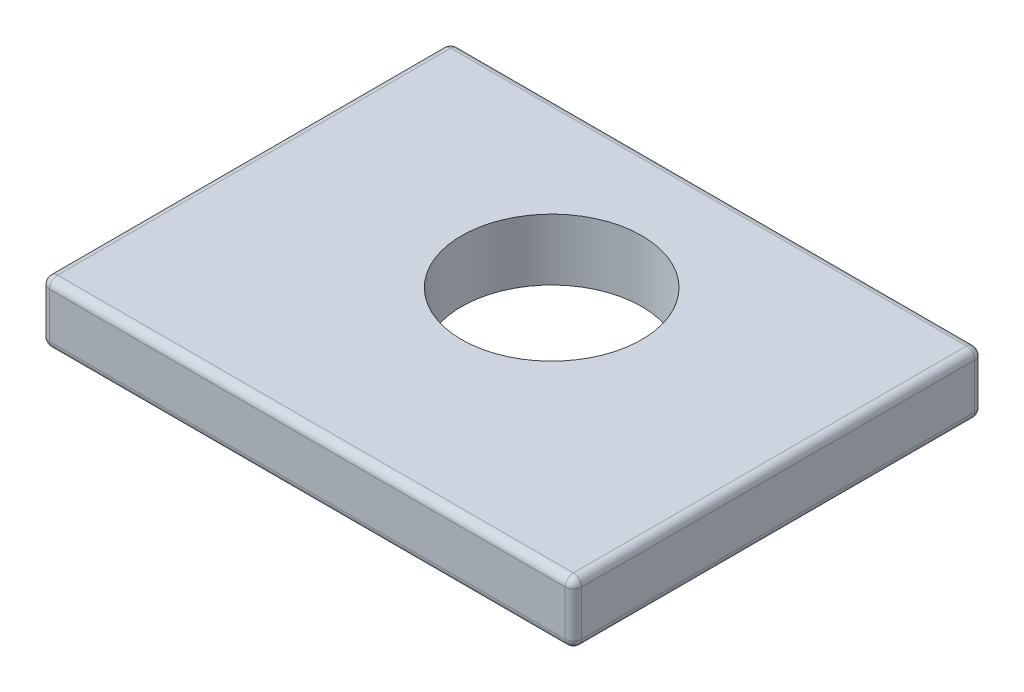
ISO-10303-21;
HEADER;
FILE_DESCRIPTION(('STEP AP214'),'2;1');
FILE_NAME('part.step','',(''),(''),'','','');
FILE_SCHEMA(('AUTOMOTIVE_DESIGN { 1 0 10303 214 1 1 1 1 }'));
ENDSEC;
DATA;
#1=APPLICATION_CONTEXT('core data for automotive mechanical design processes');
#2=APPLICATION_PROTOCOL_DEFINITION('international standard','automotive_design',2000,#1);
#3=PRODUCT_CONTEXT('',#1,'mechanical');
#4=PRODUCT('Part','Part','',(#3));
#5=PRODUCT_RELATED_PRODUCT_CATEGORY('part','',(#4));
#6=PRODUCT_DEFINITION_FORMATION('','',#4);
#7=PRODUCT_DEFINITION_CONTEXT('part definition',#1,'design');
#8=PRODUCT_DEFINITION('design','',#6,#7);
#9=PRODUCT_DEFINITION_SHAPE('','',#8);
#10=(LENGTH_UNIT() NAMED_UNIT(*) SI_UNIT(.MILLI.,.METRE.));
#11=(NAMED_UNIT(*) PLANE_ANGLE_UNIT() SI_UNIT($,.RADIAN.));
#12=(NAMED_UNIT(*) SI_UNIT($,.STERADIAN.) SOLID_ANGLE_UNIT());
#13=UNCERTAINTY_MEASURE_WITH_UNIT(LENGTH_MEASURE(1.E-05),#10,'distance_accuracy_value','');
#14=(GEOMETRIC_REPRESENTATION_CONTEXT(3) GLOBAL_UNCERTAINTY_ASSIGNED_CONTEXT((#13)) GLOBAL_UNIT_ASSIGNED_CONTEXT((#10,
#11,#12)) REPRESENTATION_CONTEXT('',''));
#15=CARTESIAN_POINT('',(0.,0.,0.));
#16=DIRECTION('',(0.,0.,1.));
#17=DIRECTION('',(1.,0.,0.));
#18=AXIS2_PLACEMENT_3D('',#15,#16,#17);
#19=CARTESIAN_POINT('',(3.25,0.75,2.5));
#20=DIRECTION('',(-1.,0.,0.));
#21=DIRECTION('',(0.,0.,1.));
#22=AXIS2_PLACEMENT_3D('',#19,#20,#21);
#23=PLANE('',#22);
#24=DIRECTION('',(0.,0.,-1.));
#25=VECTOR('',#24,1.);
#26=CARTESIAN_POINT('',(3.25,0.65,2.5));
#27=LINE('',#26,#25);
#28=CARTESIAN_POINT('',(3.25,0.65,-2.4));
#29=VERTEX_POINT('',#28);
#30=CARTESIAN_POINT('',(3.25,0.65,2.4));
#31=VERTEX_POINT('',#30);
#32=EDGE_CURVE('E130',#29,#31,#27,.F.);
#33=ORIENTED_EDGE('',*,*,#32,.T.);
#34=DIRECTION('',(0.,-1.,0.));
#35=VECTOR('',#34,1.);
#36=CARTESIAN_POINT('',(3.25,0.75,2.4));
#37=LINE('',#36,#35);
#38=CARTESIAN_POINT('',(3.25,0.1,2.4));
#39=VERTEX_POINT('',#38);
#40=EDGE_CURVE('E168',#31,#39,#37,.T.);
#41=ORIENTED_EDGE('',*,*,#40,.T.);
#42=DIRECTION('',(0.,0.,-1.));
#43=VECTOR('',#42,1.);
#44=CARTESIAN_POINT('',(3.25,0.1,-2.5));
#45=LINE('',#44,#43);
#46=CARTESIAN_POINT('',(3.25,0.1,-2.4));
#47=VERTEX_POINT('',#46);
#48=EDGE_CURVE('E161',#39,#47,#45,.T.);
#49=ORIENTED_EDGE('',*,*,#48,.T.);
#50=DIRECTION('',(0.,-1.,0.));
#51=VECTOR('',#50,1.);
#52=CARTESIAN_POINT('',(3.25,0.75,-2.4));
#53=LINE('',#52,#51);
#54=EDGE_CURVE('E159',#47,#29,#53,.F.);
#55=ORIENTED_EDGE('',*,*,#54,.T.);
#56=EDGE_LOOP('',(#33,#41,#49,#55));
#57=FACE_BOUND('',#56,.T.);
#58=ADVANCED_FACE('F34',(#57),#23,.F.);
#59=CARTESIAN_POINT('',(-3.25,0.75,-2.5));
#60=DIRECTION('',(0.,0.,1.));
#61=DIRECTION('',(1.,0.,0.));
#62=AXIS2_PLACEMENT_3D('',#59,#60,#61);
#63=PLANE('',#62);
#64=DIRECTION('',(-1.,0.,0.));
#65=VECTOR('',#64,1.);
#66=CARTESIAN_POINT('',(-3.25,0.65,-2.5));
#67=LINE('',#66,#65);
#68=CARTESIAN_POINT('',(-3.15,0.65,-2.5));
#69=VERTEX_POINT('',#68);
#70=CARTESIAN_POINT('',(3.15,0.65,-2.5));
#71=VERTEX_POINT('',#70);
#72=EDGE_CURVE('E43',#69,#71,#67,.F.);
#73=ORIENTED_EDGE('',*,*,#72,.T.);
#74=DIRECTION('',(0.,-1.,0.));
#75=VECTOR('',#74,1.);
#76=CARTESIAN_POINT('',(3.15,0.75,-2.5));
#77=LINE('',#76,#75);
#78=CARTESIAN_POINT('',(3.15,0.1,-2.5));
#79=VERTEX_POINT('',#78);
#80=EDGE_CURVE('E11',#71,#79,#77,.T.);
#81=ORIENTED_EDGE('',*,*,#80,.T.);
#82=DIRECTION('',(-1.,0.,0.));
#83=VECTOR('',#82,1.);
#84=CARTESIAN_POINT('',(-3.25,0.1,-2.5));
#85=LINE('',#84,#83);
#86=CARTESIAN_POINT('',(-3.15,0.1,-2.5));
#87=VERTEX_POINT('',#86);
#88=EDGE_CURVE('E197',#79,#87,#85,.T.);
#89=ORIENTED_EDGE('',*,*,#88,.T.);
#90=DIRECTION('',(0.,-1.,0.));
#91=VECTOR('',#90,1.);
#92=CARTESIAN_POINT('',(-3.15,0.75,-2.5));
#93=LINE('',#92,#91);
#94=EDGE_CURVE('E54',#87,#69,#93,.F.);
#95=ORIENTED_EDGE('',*,*,#94,.T.);
#96=EDGE_LOOP('',(#73,#81,#89,#95));
#97=FACE_BOUND('',#96,.T.);
#98=ADVANCED_FACE('F296',(#97),#63,.F.);
#99=CARTESIAN_POINT('',(-3.25,0.75,2.5));
#100=DIRECTION('',(1.,0.,0.));
#101=DIRECTION('',(0.,0.,-1.));
#102=AXIS2_PLACEMENT_3D('',#99,#100,#101);
#103=PLANE('',#102);
#104=DIRECTION('',(0.,-1.,0.));
#105=VECTOR('',#104,1.);
#106=CARTESIAN_POINT('',(-3.25,0.75,2.4));
#107=LINE('',#106,#105);
#108=CARTESIAN_POINT('',(-3.25,0.1,2.4));
#109=VERTEX_POINT('',#108);
#110=CARTESIAN_POINT('',(-3.25,0.65,2.4));
#111=VERTEX_POINT('',#110);
#112=EDGE_CURVE('E192',#109,#111,#107,.F.);
#113=ORIENTED_EDGE('',*,*,#112,.T.);
#114=DIRECTION('',(0.,0.,1.));
#115=VECTOR('',#114,1.);
#116=CARTESIAN_POINT('',(-3.25,0.65,2.5));
#117=LINE('',#116,#115);
#118=CARTESIAN_POINT('',(-3.25,0.65,-2.4));
#119=VERTEX_POINT('',#118);
#120=EDGE_CURVE('E194',#111,#119,#117,.F.);
#121=ORIENTED_EDGE('',*,*,#120,.T.);
#122=DIRECTION('',(0.,-1.,0.));
#123=VECTOR('',#122,1.);
#124=CARTESIAN_POINT('',(-3.25,0.75,-2.4));
#125=LINE('',#124,#123);
#126=CARTESIAN_POINT('',(-3.25,0.1,-2.4));
#127=VERTEX_POINT('',#126);
#128=EDGE_CURVE('E188',#119,#127,#125,.T.);
#129=ORIENTED_EDGE('',*,*,#128,.T.);
#130=DIRECTION('',(0.,0.,1.));
#131=VECTOR('',#130,1.);
#132=CARTESIAN_POINT('',(-3.25,0.1,2.5));
#133=LINE('',#132,#131);
#134=EDGE_CURVE('E190',#127,#109,#133,.T.);
#135=ORIENTED_EDGE('',*,*,#134,.T.);
#136=EDGE_LOOP('',(#113,#121,#129,#135));
#137=FACE_BOUND('',#136,.T.);
#138=ADVANCED_FACE('F324',(#137),#103,.F.);
#139=CARTESIAN_POINT('',(-3.25,0.75,2.5));
#140=DIRECTION('',(0.,0.,-1.));
#141=DIRECTION('',(-1.,0.,0.));
#142=AXIS2_PLACEMENT_3D('',#139,#140,#141);
#143=PLANE('',#142);
#144=DIRECTION('',(0.,-1.,0.));
#145=VECTOR('',#144,1.);
#146=CARTESIAN_POINT('',(3.15,0.75,2.5));
#147=LINE('',#146,#145);
#148=CARTESIAN_POINT('',(3.15,0.1,2.5));
#149=VERTEX_POINT('',#148);
#150=CARTESIAN_POINT('',(3.15,0.65,2.5));
#151=VERTEX_POINT('',#150);
#152=EDGE_CURVE('E183',#149,#151,#147,.F.);
#153=ORIENTED_EDGE('',*,*,#152,.T.);
#154=DIRECTION('',(1.,0.,0.));
#155=VECTOR('',#154,1.);
#156=CARTESIAN_POINT('',(-3.25,0.65,2.5));
#157=LINE('',#156,#155);
#158=CARTESIAN_POINT('',(-3.15,0.65,2.5));
#159=VERTEX_POINT('',#158);
#160=EDGE_CURVE('E185',#151,#159,#157,.F.);
#161=ORIENTED_EDGE('',*,*,#160,.T.);
#162=DIRECTION('',(0.,-1.,0.));
#163=VECTOR('',#162,1.);
#164=CARTESIAN_POINT('',(-3.15,0.75,2.5));
#165=LINE('',#164,#163);
#166=CARTESIAN_POINT('',(-3.15,0.1,2.5));
#167=VERTEX_POINT('',#166);
#168=EDGE_CURVE('E179',#159,#167,#165,.T.);
#169=ORIENTED_EDGE('',*,*,#168,.T.);
#170=DIRECTION('',(1.,0.,0.));
#171=VECTOR('',#170,1.);
#172=CARTESIAN_POINT('',(3.25,0.1,2.5));
#173=LINE('',#172,#171);
#174=EDGE_CURVE('E181',#167,#149,#173,.T.);
#175=ORIENTED_EDGE('',*,*,#174,.T.);
#176=EDGE_LOOP('',(#153,#161,#169,#175));
#177=FACE_BOUND('',#176,.T.);
#178=ADVANCED_FACE('F499',(#177),#143,.F.);
#179=CARTESIAN_POINT('',(0.,0.75,0.));
#180=DIRECTION('',(0.,-1.,0.));
#181=DIRECTION('',(0.,0.,-1.));
#182=AXIS2_PLACEMENT_3D('',#179,#180,#181);
#183=PLANE('',#182);
#184=DIRECTION('',(1.,0.,0.));
#185=VECTOR('',#184,1.);
#186=CARTESIAN_POINT('',(0.,0.75,2.4));
#187=LINE('',#186,#185);
#188=CARTESIAN_POINT('',(-3.15,0.75,2.4));
#189=VERTEX_POINT('',#188);
#190=CARTESIAN_POINT('',(3.15,0.75,2.4));
#191=VERTEX_POINT('',#190);
#192=EDGE_CURVE('E157',#189,#191,#187,.T.);
#193=ORIENTED_EDGE('',*,*,#192,.T.);
#194=DIRECTION('',(0.,0.,-1.));
#195=VECTOR('',#194,1.);
#196=CARTESIAN_POINT('',(3.15,0.75,0.));
#197=LINE('',#196,#195);
#198=CARTESIAN_POINT('',(3.15,0.75,-2.4));
#199=VERTEX_POINT('',#198);
#200=EDGE_CURVE('E128',#191,#199,#197,.T.);
#201=ORIENTED_EDGE('',*,*,#200,.T.);
#202=DIRECTION('',(-1.,0.,0.));
#203=VECTOR('',#202,1.);
#204=CARTESIAN_POINT('',(0.,0.75,-2.4));
#205=LINE('',#204,#203);
#206=CARTESIAN_POINT('',(-3.15,0.75,-2.4));
#207=VERTEX_POINT('',#206);
#208=EDGE_CURVE('E145',#199,#207,#205,.T.);
#209=ORIENTED_EDGE('',*,*,#208,.T.);
#210=DIRECTION('',(0.,0.,1.));
#211=VECTOR('',#210,1.);
#212=CARTESIAN_POINT('',(-3.15,0.75,0.));
#213=LINE('',#212,#211);
#214=EDGE_CURVE('E151',#207,#189,#213,.T.);
#215=ORIENTED_EDGE('',*,*,#214,.T.);
#216=EDGE_LOOP('',(#193,#201,#209,#215));
#217=FACE_BOUND('',#216,.T.);
#218=CARTESIAN_POINT('',(1.33365540833097E-11,0.75,-0.484711092399059));
#219=DIRECTION('',(0.,1.,0.));
#220=DIRECTION('',(0.,0.,1.));
#221=AXIS2_PLACEMENT_3D('',#218,#219,#220);
#222=CIRCLE('',#221,1.1);
#223=CARTESIAN_POINT('',(1.33365540833097E-11,0.75,0.615288907600941));
#224=VERTEX_POINT('',#223);
#225=EDGE_CURVE('E152',#224,#224,#222,.T.);
#226=ORIENTED_EDGE('',*,*,#225,.F.);
#227=EDGE_LOOP('',(#226));
#228=FACE_BOUND('',#227,.T.);
#229=ADVANCED_FACE('F154',(#217,#228),#183,.F.);
#230=CARTESIAN_POINT('',(0.,0.,0.));
#231=DIRECTION('',(0.,-1.,0.));
#232=DIRECTION('',(0.,0.,-1.));
#233=AXIS2_PLACEMENT_3D('',#230,#231,#232);
#234=PLANE('',#233);
#235=DIRECTION('',(-1.,0.,0.));
#236=VECTOR('',#235,1.);
#237=CARTESIAN_POINT('',(3.25,0.,-2.4));
#238=LINE('',#237,#236);
#239=CARTESIAN_POINT('',(-3.15,0.,-2.4));
#240=VERTEX_POINT('',#239);
#241=CARTESIAN_POINT('',(3.15,0.,-2.4));
#242=VERTEX_POINT('',#241);
#243=EDGE_CURVE('E170',#240,#242,#238,.F.);
#244=ORIENTED_EDGE('',*,*,#243,.T.);
#245=DIRECTION('',(0.,0.,-1.));
#246=VECTOR('',#245,1.);
#247=CARTESIAN_POINT('',(3.15,0.,2.5));
#248=LINE('',#247,#246);
#249=CARTESIAN_POINT('',(3.15,0.,2.4));
#250=VERTEX_POINT('',#249);
#251=EDGE_CURVE('E176',#242,#250,#248,.F.);
#252=ORIENTED_EDGE('',*,*,#251,.T.);
#253=DIRECTION('',(1.,0.,0.));
#254=VECTOR('',#253,1.);
#255=CARTESIAN_POINT('',(-3.25,0.,2.4));
#256=LINE('',#255,#254);
#257=CARTESIAN_POINT('',(-3.15,0.,2.4));
#258=VERTEX_POINT('',#257);
#259=EDGE_CURVE('E174',#250,#258,#256,.F.);
#260=ORIENTED_EDGE('',*,*,#259,.T.);
#261=DIRECTION('',(0.,0.,1.));
#262=VECTOR('',#261,1.);
#263=CARTESIAN_POINT('',(-3.15,0.,-2.5));
#264=LINE('',#263,#262);
#265=EDGE_CURVE('E172',#258,#240,#264,.F.);
#266=ORIENTED_EDGE('',*,*,#265,.T.);
#267=EDGE_LOOP('',(#244,#252,#260,#266));
#268=FACE_BOUND('',#267,.T.);
#269=CARTESIAN_POINT('',(1.33365540833097E-11,0.,-0.484711092399059));
#270=DIRECTION('',(0.,1.,0.));
#271=DIRECTION('',(0.,0.,1.));
#272=AXIS2_PLACEMENT_3D('',#269,#270,#271);
#273=CIRCLE('',#272,1.1);
#274=CARTESIAN_POINT('',(1.33365540833097E-11,0.,0.615288907600941));
#275=VERTEX_POINT('',#274);
#276=EDGE_CURVE('E256',#275,#275,#273,.T.);
#277=ORIENTED_EDGE('',*,*,#276,.T.);
#278=EDGE_LOOP('',(#277));
#279=FACE_BOUND('',#278,.T.);
#280=ADVANCED_FACE('F483',(#268,#279),#234,.T.);
#281=CARTESIAN_POINT('',(1.33365540833097E-11,0.75,-0.484711092399059));
#282=DIRECTION('',(0.,-1.,0.));
#283=DIRECTION('',(0.,0.,-1.));
#284=AXIS2_PLACEMENT_3D('',#281,#282,#283);
#285=CYLINDRICAL_SURFACE('',#284,1.1);
#286=ORIENTED_EDGE('',*,*,#225,.T.);
#287=EDGE_LOOP('',(#286));
#288=FACE_BOUND('',#287,.T.);
#289=ORIENTED_EDGE('',*,*,#276,.F.);
#290=EDGE_LOOP('',(#289));
#291=FACE_BOUND('',#290,.T.);
#292=ADVANCED_FACE('F474',(#288,#291),#285,.F.);
#293=CARTESIAN_POINT('',(-3.15,0.1,2.5));
#294=DIRECTION('',(0.,0.,-1.));
#295=DIRECTION('',(-1.,0.,0.));
#296=AXIS2_PLACEMENT_3D('',#293,#294,#295);
#297=CYLINDRICAL_SURFACE('',#296,0.1);
#298=CARTESIAN_POINT('',(-3.15,0.1,2.4));
#299=DIRECTION('',(0.,0.,1.));
#300=DIRECTION('',(1.,0.,0.));
#301=AXIS2_PLACEMENT_3D('',#298,#299,#300);
#302=CIRCLE('',#301,0.1);
#303=EDGE_CURVE('E38',#109,#258,#302,.T.);
#304=ORIENTED_EDGE('',*,*,#303,.F.);
#305=ORIENTED_EDGE('',*,*,#134,.F.);
#306=CARTESIAN_POINT('',(-3.15,0.1,-2.4));
#307=DIRECTION('',(0.,0.,-1.));
#308=DIRECTION('',(-1.,0.,0.));
#309=AXIS2_PLACEMENT_3D('',#306,#307,#308);
#310=CIRCLE('',#309,0.1);
#311=EDGE_CURVE('E249',#240,#127,#310,.T.);
#312=ORIENTED_EDGE('',*,*,#311,.F.);
#313=ORIENTED_EDGE('',*,*,#265,.F.);
#314=EDGE_LOOP('',(#304,#305,#312,#313));
#315=FACE_BOUND('',#314,.T.);
#316=ADVANCED_FACE('F36',(#315),#297,.T.);
#317=CARTESIAN_POINT('',(-3.15,0.1,2.4));
#318=DIRECTION('',(0.,0.,1.));
#319=DIRECTION('',(1.,0.,0.));
#320=AXIS2_PLACEMENT_3D('',#317,#318,#319);
#321=SPHERICAL_SURFACE('',#320,0.1);
#322=CARTESIAN_POINT('',(-3.15,0.1,2.4));
#323=DIRECTION('',(0.,-1.,0.));
#324=DIRECTION('',(0.,0.,-1.));
#325=AXIS2_PLACEMENT_3D('',#322,#323,#324);
#326=CIRCLE('',#325,0.1);
#327=EDGE_CURVE('E244',#109,#167,#326,.F.);
#328=ORIENTED_EDGE('',*,*,#327,.F.);
#329=ORIENTED_EDGE('',*,*,#303,.T.);
#330=CARTESIAN_POINT('',(-3.15,0.1,2.4));
#331=DIRECTION('',(-1.,0.,0.));
#332=DIRECTION('',(0.,0.,1.));
#333=AXIS2_PLACEMENT_3D('',#330,#331,#332);
#334=CIRCLE('',#333,0.1);
#335=EDGE_CURVE('E247',#167,#258,#334,.F.);
#336=ORIENTED_EDGE('',*,*,#335,.F.);
#337=EDGE_LOOP('',(#328,#329,#336));
#338=FACE_BOUND('',#337,.T.);
#339=ADVANCED_FACE('F460',(#338),#321,.T.);
#340=CARTESIAN_POINT('',(-3.15,0.1,-2.4));
#341=DIRECTION('',(0.,0.,1.));
#342=DIRECTION('',(1.,0.,0.));
#343=AXIS2_PLACEMENT_3D('',#340,#341,#342);
#344=SPHERICAL_SURFACE('',#343,0.1);
#345=CARTESIAN_POINT('',(-3.15,0.1,-2.4));
#346=DIRECTION('',(-1.,0.,0.));
#347=DIRECTION('',(0.,0.,1.));
#348=AXIS2_PLACEMENT_3D('',#345,#346,#347);
#349=CIRCLE('',#348,0.1);
#350=EDGE_CURVE('E238',#240,#87,#349,.F.);
#351=ORIENTED_EDGE('',*,*,#350,.F.);
#352=ORIENTED_EDGE('',*,*,#311,.T.);
#353=CARTESIAN_POINT('',(-3.15,0.1,-2.4));
#354=DIRECTION('',(0.,-1.,0.));
#355=DIRECTION('',(0.,0.,-1.));
#356=AXIS2_PLACEMENT_3D('',#353,#354,#355);
#357=CIRCLE('',#356,0.1);
#358=EDGE_CURVE('E241',#87,#127,#357,.F.);
#359=ORIENTED_EDGE('',*,*,#358,.F.);
#360=EDGE_LOOP('',(#351,#352,#359));
#361=FACE_BOUND('',#360,.T.);
#362=ADVANCED_FACE('F302',(#361),#344,.T.);
#363=CARTESIAN_POINT('',(-3.25,0.1,2.4));
#364=DIRECTION('',(-1.,0.,0.));
#365=DIRECTION('',(0.,0.,1.));
#366=AXIS2_PLACEMENT_3D('',#363,#364,#365);
#367=CYLINDRICAL_SURFACE('',#366,0.1);
#368=ORIENTED_EDGE('',*,*,#335,.T.);
#369=ORIENTED_EDGE('',*,*,#259,.F.);
#370=CARTESIAN_POINT('',(3.15,0.1,2.4));
#371=DIRECTION('',(1.,0.,0.));
#372=DIRECTION('',(0.,0.,-1.));
#373=AXIS2_PLACEMENT_3D('',#370,#371,#372);
#374=CIRCLE('',#373,0.1);
#375=EDGE_CURVE('E233',#149,#250,#374,.T.);
#376=ORIENTED_EDGE('',*,*,#375,.F.);
#377=ORIENTED_EDGE('',*,*,#174,.F.);
#378=EDGE_LOOP('',(#368,#369,#376,#377));
#379=FACE_BOUND('',#378,.T.);
#380=ADVANCED_FACE('F443',(#379),#367,.T.);
#381=CARTESIAN_POINT('',(-3.15,0.75,2.4));
#382=DIRECTION('',(0.,-1.,0.));
#383=DIRECTION('',(0.,0.,-1.));
#384=AXIS2_PLACEMENT_3D('',#381,#382,#383);
#385=CYLINDRICAL_SURFACE('',#384,0.1);
#386=ORIENTED_EDGE('',*,*,#327,.T.);
#387=ORIENTED_EDGE('',*,*,#168,.F.);
#388=CARTESIAN_POINT('',(-3.15,0.65,2.4));
#389=DIRECTION('',(0.,1.,0.));
#390=DIRECTION('',(0.,0.,1.));
#391=AXIS2_PLACEMENT_3D('',#388,#389,#390);
#392=CIRCLE('',#391,0.1);
#393=EDGE_CURVE('E230',#111,#159,#392,.T.);
#394=ORIENTED_EDGE('',*,*,#393,.F.);
#395=ORIENTED_EDGE('',*,*,#112,.F.);
#396=EDGE_LOOP('',(#386,#387,#394,#395));
#397=FACE_BOUND('',#396,.T.);
#398=ADVANCED_FACE('F435',(#397),#385,.T.);
#399=CARTESIAN_POINT('',(-3.15,0.65,0.));
#400=DIRECTION('',(0.,0.,1.));
#401=DIRECTION('',(1.,0.,0.));
#402=AXIS2_PLACEMENT_3D('',#399,#400,#401);
#403=CYLINDRICAL_SURFACE('',#402,0.1);
#404=CARTESIAN_POINT('',(-3.15,0.65,-2.4));
#405=DIRECTION('',(0.,0.,-1.));
#406=DIRECTION('',(0.,1.,0.));
#407=AXIS2_PLACEMENT_3D('',#404,#405,#406);
#408=CIRCLE('',#407,0.1);
#409=EDGE_CURVE('E224',#119,#207,#408,.T.);
#410=ORIENTED_EDGE('',*,*,#409,.F.);
#411=ORIENTED_EDGE('',*,*,#120,.F.);
#412=CARTESIAN_POINT('',(-3.15,0.65,2.4));
#413=DIRECTION('',(0.,0.,1.));
#414=DIRECTION('',(1.,0.,0.));
#415=AXIS2_PLACEMENT_3D('',#412,#413,#414);
#416=CIRCLE('',#415,0.1);
#417=EDGE_CURVE('E227',#189,#111,#416,.T.);
#418=ORIENTED_EDGE('',*,*,#417,.F.);
#419=ORIENTED_EDGE('',*,*,#214,.F.);
#420=EDGE_LOOP('',(#410,#411,#418,#419));
#421=FACE_BOUND('',#420,.T.);
#422=ADVANCED_FACE('F272',(#421),#403,.T.);
#423=CARTESIAN_POINT('',(-3.15,0.75,-2.4));
#424=DIRECTION('',(0.,-1.,0.));
#425=DIRECTION('',(0.,0.,-1.));
#426=AXIS2_PLACEMENT_3D('',#423,#424,#425);
#427=CYLINDRICAL_SURFACE('',#426,0.1);
#428=ORIENTED_EDGE('',*,*,#358,.T.);
#429=ORIENTED_EDGE('',*,*,#128,.F.);
#430=CARTESIAN_POINT('',(-3.15,0.65,-2.4));
#431=DIRECTION('',(0.,1.,0.));
#432=DIRECTION('',(0.,0.,1.));
#433=AXIS2_PLACEMENT_3D('',#430,#431,#432);
#434=CIRCLE('',#433,0.1);
#435=EDGE_CURVE('E222',#69,#119,#434,.T.);
#436=ORIENTED_EDGE('',*,*,#435,.F.);
#437=ORIENTED_EDGE('',*,*,#94,.F.);
#438=EDGE_LOOP('',(#428,#429,#436,#437));
#439=FACE_BOUND('',#438,.T.);
#440=ADVANCED_FACE('F305',(#439),#427,.T.);
#441=CARTESIAN_POINT('',(-3.25,0.1,-2.4));
#442=DIRECTION('',(1.,0.,0.));
#443=DIRECTION('',(0.,0.,-1.));
#444=AXIS2_PLACEMENT_3D('',#441,#442,#443);
#445=CYLINDRICAL_SURFACE('',#444,0.1);
#446=ORIENTED_EDGE('',*,*,#350,.T.);
#447=ORIENTED_EDGE('',*,*,#88,.F.);
#448=CARTESIAN_POINT('',(3.15,0.1,-2.4));
#449=DIRECTION('',(1.,0.,0.));
#450=DIRECTION('',(0.,0.,-1.));
#451=AXIS2_PLACEMENT_3D('',#448,#449,#450);
#452=CIRCLE('',#451,0.1);
#453=EDGE_CURVE('E219',#242,#79,#452,.T.);
#454=ORIENTED_EDGE('',*,*,#453,.F.);
#455=ORIENTED_EDGE('',*,*,#243,.F.);
#456=EDGE_LOOP('',(#446,#447,#454,#455));
#457=FACE_BOUND('',#456,.T.);
#458=ADVANCED_FACE('F301',(#457),#445,.T.);
#459=CARTESIAN_POINT('',(3.15,0.1,2.5));
#460=DIRECTION('',(0.,0.,1.));
#461=DIRECTION('',(1.,0.,0.));
#462=AXIS2_PLACEMENT_3D('',#459,#460,#461);
#463=CYLINDRICAL_SURFACE('',#462,0.1);
#464=CARTESIAN_POINT('',(3.15,0.1,2.4));
#465=DIRECTION('',(0.,0.,1.));
#466=DIRECTION('',(1.,0.,0.));
#467=AXIS2_PLACEMENT_3D('',#464,#465,#466);
#468=CIRCLE('',#467,0.1);
#469=EDGE_CURVE('E235',#250,#39,#468,.T.);
#470=ORIENTED_EDGE('',*,*,#469,.F.);
#471=ORIENTED_EDGE('',*,*,#251,.F.);
#472=CARTESIAN_POINT('',(3.15,0.1,-2.4));
#473=DIRECTION('',(0.,0.,-1.));
#474=DIRECTION('',(-1.,0.,0.));
#475=AXIS2_PLACEMENT_3D('',#472,#473,#474);
#476=CIRCLE('',#475,0.1);
#477=EDGE_CURVE('E216',#47,#242,#476,.T.);
#478=ORIENTED_EDGE('',*,*,#477,.F.);
#479=ORIENTED_EDGE('',*,*,#48,.F.);
#480=EDGE_LOOP('',(#470,#471,#478,#479));
#481=FACE_BOUND('',#480,.T.);
#482=ADVANCED_FACE('F404',(#481),#463,.T.);
#483=CARTESIAN_POINT('',(3.15,0.1,2.4));
#484=DIRECTION('',(0.,0.,1.));
#485=DIRECTION('',(1.,0.,0.));
#486=AXIS2_PLACEMENT_3D('',#483,#484,#485);
#487=SPHERICAL_SURFACE('',#486,0.1);
#488=ORIENTED_EDGE('',*,*,#375,.T.);
#489=ORIENTED_EDGE('',*,*,#469,.T.);
#490=CARTESIAN_POINT('',(3.15,0.1,2.4));
#491=DIRECTION('',(0.,-1.,0.));
#492=DIRECTION('',(0.,0.,-1.));
#493=AXIS2_PLACEMENT_3D('',#490,#491,#492);
#494=CIRCLE('',#493,0.1);
#495=EDGE_CURVE('E213',#149,#39,#494,.F.);
#496=ORIENTED_EDGE('',*,*,#495,.F.);
#497=EDGE_LOOP('',(#488,#489,#496));
#498=FACE_BOUND('',#497,.T.);
#499=ADVANCED_FACE('F317',(#498),#487,.T.);
#500=CARTESIAN_POINT('',(-3.15,0.65,2.4));
#501=DIRECTION('',(0.,0.,1.));
#502=DIRECTION('',(1.,0.,0.));
#503=AXIS2_PLACEMENT_3D('',#500,#501,#502);
#504=SPHERICAL_SURFACE('',#503,0.1);
#505=ORIENTED_EDGE('',*,*,#417,.T.);
#506=ORIENTED_EDGE('',*,*,#393,.T.);
#507=CARTESIAN_POINT('',(-3.15,0.65,2.4));
#508=DIRECTION('',(-1.,0.,0.));
#509=DIRECTION('',(0.,0.,1.));
#510=AXIS2_PLACEMENT_3D('',#507,#508,#509);
#511=CIRCLE('',#510,0.1);
#512=EDGE_CURVE('E211',#189,#159,#511,.F.);
#513=ORIENTED_EDGE('',*,*,#512,.F.);
#514=EDGE_LOOP('',(#505,#506,#513));
#515=FACE_BOUND('',#514,.T.);
#516=ADVANCED_FACE('F275',(#515),#504,.T.);
#517=CARTESIAN_POINT('',(-3.15,0.65,-2.4));
#518=DIRECTION('',(0.,0.,1.));
#519=DIRECTION('',(1.,0.,0.));
#520=AXIS2_PLACEMENT_3D('',#517,#518,#519);
#521=SPHERICAL_SURFACE('',#520,0.1);
#522=ORIENTED_EDGE('',*,*,#435,.T.);
#523=ORIENTED_EDGE('',*,*,#409,.T.);
#524=CARTESIAN_POINT('',(-3.15,0.65,-2.4));
#525=DIRECTION('',(-1.,0.,0.));
#526=DIRECTION('',(0.,0.,1.));
#527=AXIS2_PLACEMENT_3D('',#524,#525,#526);
#528=CIRCLE('',#527,0.1);
#529=EDGE_CURVE('E148',#69,#207,#528,.F.);
#530=ORIENTED_EDGE('',*,*,#529,.F.);
#531=EDGE_LOOP('',(#522,#523,#530));
#532=FACE_BOUND('',#531,.T.);
#533=ADVANCED_FACE('F307',(#532),#521,.T.);
#534=CARTESIAN_POINT('',(3.15,0.1,-2.4));
#535=DIRECTION('',(0.,0.,1.));
#536=DIRECTION('',(1.,0.,0.));
#537=AXIS2_PLACEMENT_3D('',#534,#535,#536);
#538=SPHERICAL_SURFACE('',#537,0.1);
#539=ORIENTED_EDGE('',*,*,#477,.T.);
#540=ORIENTED_EDGE('',*,*,#453,.T.);
#541=CARTESIAN_POINT('',(3.15,0.1,-2.4));
#542=DIRECTION('',(0.,-1.,0.));
#543=DIRECTION('',(0.,0.,-1.));
#544=AXIS2_PLACEMENT_3D('',#541,#542,#543);
#545=CIRCLE('',#544,0.1);
#546=EDGE_CURVE('E208',#47,#79,#545,.F.);
#547=ORIENTED_EDGE('',*,*,#546,.F.);
#548=EDGE_LOOP('',(#539,#540,#547));
#549=FACE_BOUND('',#548,.T.);
#550=ADVANCED_FACE('F309',(#549),#538,.T.);
#551=CARTESIAN_POINT('',(3.15,0.75,2.4));
#552=DIRECTION('',(0.,-1.,0.));
#553=DIRECTION('',(0.,0.,-1.));
#554=AXIS2_PLACEMENT_3D('',#551,#552,#553);
#555=CYLINDRICAL_SURFACE('',#554,0.1);
#556=ORIENTED_EDGE('',*,*,#495,.T.);
#557=ORIENTED_EDGE('',*,*,#40,.F.);
#558=CARTESIAN_POINT('',(3.15,0.65,2.4));
#559=DIRECTION('',(0.,1.,0.));
#560=DIRECTION('',(0.,0.,1.));
#561=AXIS2_PLACEMENT_3D('',#558,#559,#560);
#562=CIRCLE('',#561,0.1);
#563=EDGE_CURVE('E205',#151,#31,#562,.T.);
#564=ORIENTED_EDGE('',*,*,#563,.F.);
#565=ORIENTED_EDGE('',*,*,#152,.F.);
#566=EDGE_LOOP('',(#556,#557,#564,#565));
#567=FACE_BOUND('',#566,.T.);
#568=ADVANCED_FACE('F287',(#567),#555,.T.);
#569=CARTESIAN_POINT('',(0.,0.65,2.4));
#570=DIRECTION('',(1.,0.,0.));
#571=DIRECTION('',(0.,0.,-1.));
#572=AXIS2_PLACEMENT_3D('',#569,#570,#571);
#573=CYLINDRICAL_SURFACE('',#572,0.1);
#574=ORIENTED_EDGE('',*,*,#512,.T.);
#575=ORIENTED_EDGE('',*,*,#160,.F.);
#576=CARTESIAN_POINT('',(3.15,0.65,2.4));
#577=DIRECTION('',(1.,0.,0.));
#578=DIRECTION('',(0.,0.,-1.));
#579=AXIS2_PLACEMENT_3D('',#576,#577,#578);
#580=CIRCLE('',#579,0.1);
#581=EDGE_CURVE('E142',#191,#151,#580,.T.);
#582=ORIENTED_EDGE('',*,*,#581,.F.);
#583=ORIENTED_EDGE('',*,*,#192,.F.);
#584=EDGE_LOOP('',(#574,#575,#582,#583));
#585=FACE_BOUND('',#584,.T.);
#586=ADVANCED_FACE('F279',(#585),#573,.T.);
#587=CARTESIAN_POINT('',(0.,0.65,-2.4));
#588=DIRECTION('',(-1.,0.,0.));
#589=DIRECTION('',(0.,0.,1.));
#590=AXIS2_PLACEMENT_3D('',#587,#588,#589);
#591=CYLINDRICAL_SURFACE('',#590,0.1);
#592=ORIENTED_EDGE('',*,*,#529,.T.);
#593=ORIENTED_EDGE('',*,*,#208,.F.);
#594=CARTESIAN_POINT('',(3.15,0.65,-2.4));
#595=DIRECTION('',(1.,0.,0.));
#596=DIRECTION('',(0.,1.,0.));
#597=AXIS2_PLACEMENT_3D('',#594,#595,#596);
#598=CIRCLE('',#597,0.1);
#599=EDGE_CURVE('E136',#71,#199,#598,.T.);
#600=ORIENTED_EDGE('',*,*,#599,.F.);
#601=ORIENTED_EDGE('',*,*,#72,.F.);
#602=EDGE_LOOP('',(#592,#593,#600,#601));
#603=FACE_BOUND('',#602,.T.);
#604=ADVANCED_FACE('F146',(#603),#591,.T.);
#605=CARTESIAN_POINT('',(3.15,0.75,-2.4));
#606=DIRECTION('',(0.,-1.,0.));
#607=DIRECTION('',(0.,0.,-1.));
#608=AXIS2_PLACEMENT_3D('',#605,#606,#607);
#609=CYLINDRICAL_SURFACE('',#608,0.1);
#610=ORIENTED_EDGE('',*,*,#546,.T.);
#611=ORIENTED_EDGE('',*,*,#80,.F.);
#612=CARTESIAN_POINT('',(3.15,0.65,-2.4));
#613=DIRECTION('',(0.,1.,0.));
#614=DIRECTION('',(0.,0.,1.));
#615=AXIS2_PLACEMENT_3D('',#612,#613,#614);
#616=CIRCLE('',#615,0.1);
#617=EDGE_CURVE('E140',#29,#71,#616,.T.);
#618=ORIENTED_EDGE('',*,*,#617,.F.);
#619=ORIENTED_EDGE('',*,*,#54,.F.);
#620=EDGE_LOOP('',(#610,#611,#618,#619));
#621=FACE_BOUND('',#620,.T.);
#622=ADVANCED_FACE('F294',(#621),#609,.T.);
#623=CARTESIAN_POINT('',(3.15,0.65,2.4));
#624=DIRECTION('',(0.,0.,1.));
#625=DIRECTION('',(1.,0.,0.));
#626=AXIS2_PLACEMENT_3D('',#623,#624,#625);
#627=SPHERICAL_SURFACE('',#626,0.1);
#628=ORIENTED_EDGE('',*,*,#581,.T.);
#629=ORIENTED_EDGE('',*,*,#563,.T.);
#630=CARTESIAN_POINT('',(3.15,0.65,2.4));
#631=DIRECTION('',(0.,0.,1.));
#632=DIRECTION('',(1.,0.,0.));
#633=AXIS2_PLACEMENT_3D('',#630,#631,#632);
#634=CIRCLE('',#633,0.1);
#635=EDGE_CURVE('E133',#191,#31,#634,.F.);
#636=ORIENTED_EDGE('',*,*,#635,.F.);
#637=EDGE_LOOP('',(#628,#629,#636));
#638=FACE_BOUND('',#637,.T.);
#639=ADVANCED_FACE('F283',(#638),#627,.T.);
#640=CARTESIAN_POINT('',(3.15,0.65,-2.4));
#641=DIRECTION('',(0.,0.,1.));
#642=DIRECTION('',(1.,0.,0.));
#643=AXIS2_PLACEMENT_3D('',#640,#641,#642);
#644=SPHERICAL_SURFACE('',#643,0.1);
#645=ORIENTED_EDGE('',*,*,#617,.T.);
#646=ORIENTED_EDGE('',*,*,#599,.T.);
#647=CARTESIAN_POINT('',(3.15,0.65,-2.4));
#648=DIRECTION('',(0.,0.,-1.));
#649=DIRECTION('',(-1.,0.,0.));
#650=AXIS2_PLACEMENT_3D('',#647,#648,#649);
#651=CIRCLE('',#650,0.1);
#652=EDGE_CURVE('E124',#29,#199,#651,.F.);
#653=ORIENTED_EDGE('',*,*,#652,.F.);
#654=EDGE_LOOP('',(#645,#646,#653));
#655=FACE_BOUND('',#654,.T.);
#656=ADVANCED_FACE('F138',(#655),#644,.T.);
#657=CARTESIAN_POINT('',(3.15,0.65,0.));
#658=DIRECTION('',(0.,0.,-1.));
#659=DIRECTION('',(-1.,0.,0.));
#660=AXIS2_PLACEMENT_3D('',#657,#658,#659);
#661=CYLINDRICAL_SURFACE('',#660,0.1);
#662=ORIENTED_EDGE('',*,*,#635,.T.);
#663=ORIENTED_EDGE('',*,*,#32,.F.);
#664=ORIENTED_EDGE('',*,*,#652,.T.);
#665=ORIENTED_EDGE('',*,*,#200,.F.);
#666=EDGE_LOOP('',(#662,#663,#664,#665));
#667=FACE_BOUND('',#666,.T.);
#668=ADVANCED_FACE('F126',(#667),#661,.T.);
#669=CLOSED_SHELL('',(#58,#98,#138,#178,#229,#280,#292,#316,#339,#362,#380,#398,#422,#440,#458,
#482,#499,#516,#533,#550,#568,#586,#604,#622,#639,#656,#668));
#670=MANIFOLD_SOLID_BREP('B2',#669);
#671=ADVANCED_BREP_SHAPE_REPRESENTATION('',(#18,#670),#14);
#672=SHAPE_DEFINITION_REPRESENTATION(#9,#671);
ENDSEC;
END-ISO-10303-21;
